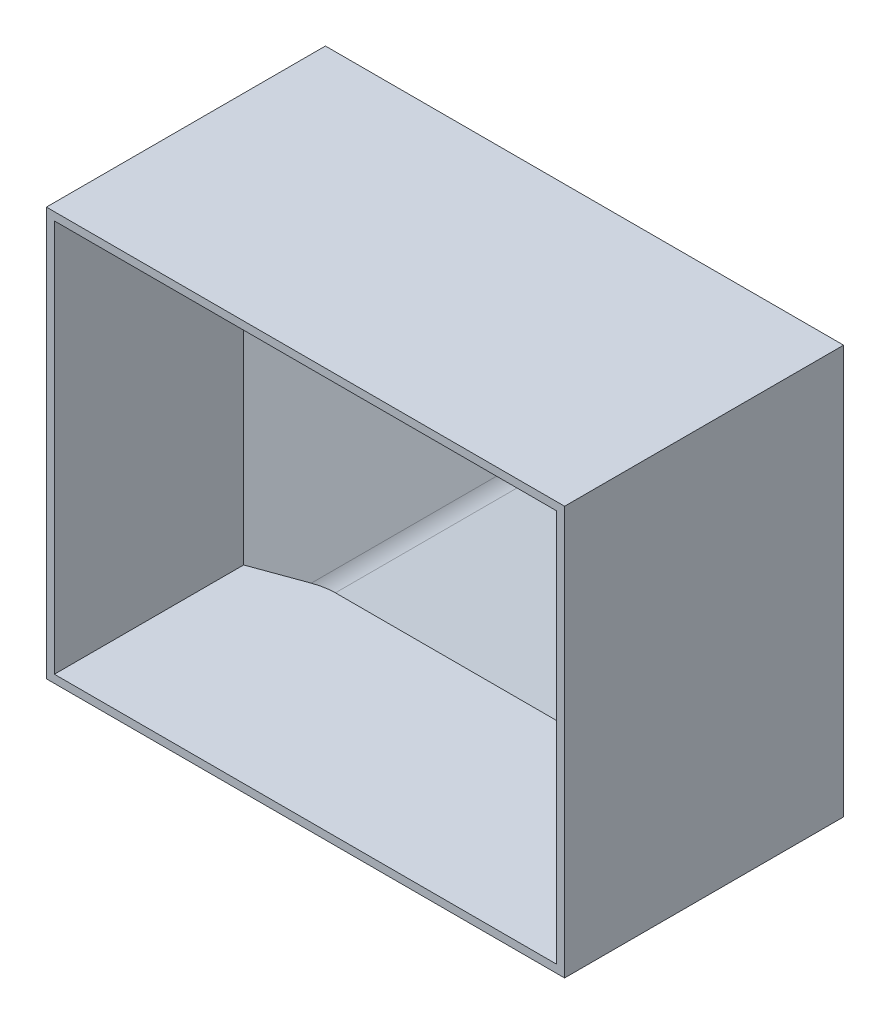
ISO-10303-21;
HEADER;
FILE_DESCRIPTION(('STEP AP214'),'2;1');
FILE_NAME('part.step','',(''),(''),'','','');
FILE_SCHEMA(('AUTOMOTIVE_DESIGN { 1 0 10303 214 1 1 1 1 }'));
ENDSEC;
DATA;
#1=APPLICATION_CONTEXT('core data for automotive mechanical design processes');
#2=APPLICATION_PROTOCOL_DEFINITION('international standard','automotive_design',2000,#1);
#3=PRODUCT_CONTEXT('',#1,'mechanical');
#4=PRODUCT('Part','Part','',(#3));
#5=PRODUCT_RELATED_PRODUCT_CATEGORY('part','',(#4));
#6=PRODUCT_DEFINITION_FORMATION('','',#4);
#7=PRODUCT_DEFINITION_CONTEXT('part definition',#1,'design');
#8=PRODUCT_DEFINITION('design','',#6,#7);
#9=PRODUCT_DEFINITION_SHAPE('','',#8);
#10=(LENGTH_UNIT() NAMED_UNIT(*) SI_UNIT(.MILLI.,.METRE.));
#11=(NAMED_UNIT(*) PLANE_ANGLE_UNIT() SI_UNIT($,.RADIAN.));
#12=(NAMED_UNIT(*) SI_UNIT($,.STERADIAN.) SOLID_ANGLE_UNIT());
#13=UNCERTAINTY_MEASURE_WITH_UNIT(LENGTH_MEASURE(1.E-05),#10,'distance_accuracy_value','');
#14=(GEOMETRIC_REPRESENTATION_CONTEXT(3) GLOBAL_UNCERTAINTY_ASSIGNED_CONTEXT((#13)) GLOBAL_UNIT_ASSIGNED_CONTEXT((#10,
#11,#12)) REPRESENTATION_CONTEXT('',''));
#15=CARTESIAN_POINT('',(0.,0.,0.));
#16=DIRECTION('',(0.,0.,1.));
#17=DIRECTION('',(1.,0.,0.));
#18=AXIS2_PLACEMENT_3D('',#15,#16,#17);
#19=CARTESIAN_POINT('',(126.,102.5,140.));
#20=DIRECTION('',(-1.,0.,0.));
#21=DIRECTION('',(0.,0.,1.));
#22=AXIS2_PLACEMENT_3D('',#19,#20,#21);
#23=PLANE('',#22);
#24=DIRECTION('',(0.,0.,-1.));
#25=VECTOR('',#24,1.);
#26=CARTESIAN_POINT('',(126.,98.5,140.));
#27=LINE('',#26,#25);
#28=CARTESIAN_POINT('',(126.,98.5,140.));
#29=VERTEX_POINT('',#28);
#30=CARTESIAN_POINT('',(126.,98.5,45.0367257692824));
#31=VERTEX_POINT('',#30);
#32=EDGE_CURVE('E182',#29,#31,#27,.T.);
#33=ORIENTED_EDGE('',*,*,#32,.T.);
#34=DIRECTION('',(0.,-1.,0.));
#35=VECTOR('',#34,1.);
#36=CARTESIAN_POINT('',(126.,102.5,45.0367257692824));
#37=LINE('',#36,#35);
#38=CARTESIAN_POINT('',(126.,-98.5,45.0367257692824));
#39=VERTEX_POINT('',#38);
#40=EDGE_CURVE('E275',#31,#39,#37,.T.);
#41=ORIENTED_EDGE('',*,*,#40,.T.);
#42=DIRECTION('',(0.,0.,-1.));
#43=VECTOR('',#42,1.);
#44=CARTESIAN_POINT('',(126.,-98.5,140.));
#45=LINE('',#44,#43);
#46=CARTESIAN_POINT('',(126.,-98.5,140.));
#47=VERTEX_POINT('',#46);
#48=EDGE_CURVE('E187',#47,#39,#45,.T.);
#49=ORIENTED_EDGE('',*,*,#48,.F.);
#50=DIRECTION('',(0.,1.,0.));
#51=VECTOR('',#50,1.);
#52=CARTESIAN_POINT('',(126.,102.5,140.));
#53=LINE('',#52,#51);
#54=EDGE_CURVE('E179',#47,#29,#53,.T.);
#55=ORIENTED_EDGE('',*,*,#54,.T.);
#56=EDGE_LOOP('',(#33,#41,#49,#55));
#57=FACE_BOUND('',#56,.T.);
#58=ADVANCED_FACE('F70',(#57),#23,.T.);
#59=CARTESIAN_POINT('',(-130.,98.5,140.));
#60=DIRECTION('',(0.,-1.,0.));
#61=DIRECTION('',(0.,0.,-1.));
#62=AXIS2_PLACEMENT_3D('',#59,#60,#61);
#63=PLANE('',#62);
#64=DIRECTION('',(0.939692620785907,0.,-0.342020143325673));
#65=VECTOR('',#64,1.);
#66=CARTESIAN_POINT('',(-160.052696911623,98.5,57.4308938416021));
#67=LINE('',#66,#65);
#68=CARTESIAN_POINT('',(-126.,98.5,45.0367257692824));
#69=VERTEX_POINT('',#68);
#70=CARTESIAN_POINT('',(-101.130302149885,98.5,35.9848960166464));
#71=VERTEX_POINT('',#70);
#72=EDGE_CURVE('E256',#69,#71,#67,.T.);
#73=ORIENTED_EDGE('',*,*,#72,.T.);
#74=CARTESIAN_POINT('',(-96.0000000000004,98.5,50.080285328435));
#75=DIRECTION('',(0.,-1.,0.));
#76=DIRECTION('',(-0.939692620785907,0.,0.342020143325673));
#77=AXIS2_PLACEMENT_3D('',#74,#75,#76);
#78=ELLIPSE('',#77,21.9044909681132,15.);
#79=CARTESIAN_POINT('',(-90.8696978501153,98.5,34.1176187412963));
#80=VERTEX_POINT('',#79);
#81=EDGE_CURVE('E305',#71,#80,#78,.T.);
#82=ORIENTED_EDGE('',*,*,#81,.T.);
#83=DIRECTION('',(1.,0.,0.));
#84=VECTOR('',#83,1.);
#85=CARTESIAN_POINT('',(-130.,98.5,34.1176187412963));
#86=LINE('',#85,#84);
#87=CARTESIAN_POINT('',(90.8696978501153,98.5,34.1176187412963));
#88=VERTEX_POINT('',#87);
#89=EDGE_CURVE('E242',#80,#88,#86,.T.);
#90=ORIENTED_EDGE('',*,*,#89,.T.);
#91=CARTESIAN_POINT('',(96.0000000000004,98.5,50.080285328435));
#92=DIRECTION('',(0.,-1.,0.));
#93=DIRECTION('',(-0.939692620785907,0.,-0.342020143325673));
#94=AXIS2_PLACEMENT_3D('',#91,#92,#93);
#95=ELLIPSE('',#94,21.9044909681132,15.);
#96=CARTESIAN_POINT('',(101.130302149886,98.5,35.9848960166464));
#97=VERTEX_POINT('',#96);
#98=EDGE_CURVE('E85',#88,#97,#95,.T.);
#99=ORIENTED_EDGE('',*,*,#98,.T.);
#100=DIRECTION('',(0.939692620785907,0.,0.342020143325673));
#101=VECTOR('',#100,1.);
#102=CARTESIAN_POINT('',(-69.533080693843,98.5,-26.1314954176489));
#103=LINE('',#102,#101);
#104=EDGE_CURVE('E200',#97,#31,#103,.T.);
#105=ORIENTED_EDGE('',*,*,#104,.T.);
#106=ORIENTED_EDGE('',*,*,#32,.F.);
#107=DIRECTION('',(-1.,0.,0.));
#108=VECTOR('',#107,1.);
#109=CARTESIAN_POINT('',(-130.,98.5,140.));
#110=LINE('',#109,#108);
#111=CARTESIAN_POINT('',(-126.,98.5,140.));
#112=VERTEX_POINT('',#111);
#113=EDGE_CURVE('E188',#29,#112,#110,.T.);
#114=ORIENTED_EDGE('',*,*,#113,.T.);
#115=DIRECTION('',(0.,0.,-1.));
#116=VECTOR('',#115,1.);
#117=CARTESIAN_POINT('',(-126.,98.5,140.));
#118=LINE('',#117,#116);
#119=EDGE_CURVE('E196',#112,#69,#118,.T.);
#120=ORIENTED_EDGE('',*,*,#119,.T.);
#121=EDGE_LOOP('',(#73,#82,#90,#99,#105,#106,#114,#120));
#122=FACE_BOUND('',#121,.T.);
#123=ADVANCED_FACE('F191',(#122),#63,.T.);
#124=CARTESIAN_POINT('',(-126.,102.5,140.));
#125=DIRECTION('',(1.,0.,0.));
#126=DIRECTION('',(0.,0.,-1.));
#127=AXIS2_PLACEMENT_3D('',#124,#125,#126);
#128=PLANE('',#127);
#129=DIRECTION('',(0.,0.,-1.));
#130=VECTOR('',#129,1.);
#131=CARTESIAN_POINT('',(-126.,-98.5,140.));
#132=LINE('',#131,#130);
#133=CARTESIAN_POINT('',(-126.,-98.5,140.));
#134=VERTEX_POINT('',#133);
#135=CARTESIAN_POINT('',(-126.,-98.5,45.0367257692824));
#136=VERTEX_POINT('',#135);
#137=EDGE_CURVE('E215',#134,#136,#132,.T.);
#138=ORIENTED_EDGE('',*,*,#137,.T.);
#139=DIRECTION('',(0.,1.,0.));
#140=VECTOR('',#139,1.);
#141=CARTESIAN_POINT('',(-126.,102.5,45.0367257692824));
#142=LINE('',#141,#140);
#143=EDGE_CURVE('E253',#136,#69,#142,.T.);
#144=ORIENTED_EDGE('',*,*,#143,.T.);
#145=ORIENTED_EDGE('',*,*,#119,.F.);
#146=DIRECTION('',(0.,-1.,0.));
#147=VECTOR('',#146,1.);
#148=CARTESIAN_POINT('',(-126.,102.5,140.));
#149=LINE('',#148,#147);
#150=EDGE_CURVE('E203',#112,#134,#149,.T.);
#151=ORIENTED_EDGE('',*,*,#150,.T.);
#152=EDGE_LOOP('',(#138,#144,#145,#151));
#153=FACE_BOUND('',#152,.T.);
#154=ADVANCED_FACE('F326',(#153),#128,.T.);
#155=CARTESIAN_POINT('',(-130.,-98.5,140.));
#156=DIRECTION('',(0.,1.,0.));
#157=DIRECTION('',(0.,0.,1.));
#158=AXIS2_PLACEMENT_3D('',#155,#156,#157);
#159=PLANE('',#158);
#160=DIRECTION('',(-1.,0.,0.));
#161=VECTOR('',#160,1.);
#162=CARTESIAN_POINT('',(-130.,-98.5,34.1176187412963));
#163=LINE('',#162,#161);
#164=CARTESIAN_POINT('',(90.8696978501153,-98.5,34.1176187412963));
#165=VERTEX_POINT('',#164);
#166=CARTESIAN_POINT('',(-90.8696978501153,-98.5,34.1176187412963));
#167=VERTEX_POINT('',#166);
#168=EDGE_CURVE('E255',#165,#167,#163,.T.);
#169=ORIENTED_EDGE('',*,*,#168,.T.);
#170=CARTESIAN_POINT('',(-96.0000000000004,-98.5,50.080285328435));
#171=DIRECTION('',(0.,1.,0.));
#172=DIRECTION('',(0.939692620785907,0.,-0.342020143325673));
#173=AXIS2_PLACEMENT_3D('',#170,#171,#172);
#174=ELLIPSE('',#173,21.9044909681132,15.);
#175=CARTESIAN_POINT('',(-101.130302149885,-98.5,35.9848960166464));
#176=VERTEX_POINT('',#175);
#177=EDGE_CURVE('E285',#167,#176,#174,.T.);
#178=ORIENTED_EDGE('',*,*,#177,.T.);
#179=DIRECTION('',(-0.939692620785907,0.,0.342020143325673));
#180=VECTOR('',#179,1.);
#181=CARTESIAN_POINT('',(-160.052696911623,-98.5,57.4308938416021));
#182=LINE('',#181,#180);
#183=EDGE_CURVE('E269',#176,#136,#182,.T.);
#184=ORIENTED_EDGE('',*,*,#183,.T.);
#185=ORIENTED_EDGE('',*,*,#137,.F.);
#186=DIRECTION('',(1.,0.,0.));
#187=VECTOR('',#186,1.);
#188=CARTESIAN_POINT('',(-130.,-98.5,140.));
#189=LINE('',#188,#187);
#190=EDGE_CURVE('E207',#134,#47,#189,.T.);
#191=ORIENTED_EDGE('',*,*,#190,.T.);
#192=ORIENTED_EDGE('',*,*,#48,.T.);
#193=DIRECTION('',(-0.939692620785907,0.,-0.342020143325673));
#194=VECTOR('',#193,1.);
#195=CARTESIAN_POINT('',(-69.533080693843,-98.5,-26.1314954176489));
#196=LINE('',#195,#194);
#197=CARTESIAN_POINT('',(101.130302149886,-98.5,35.9848960166464));
#198=VERTEX_POINT('',#197);
#199=EDGE_CURVE('E270',#39,#198,#196,.T.);
#200=ORIENTED_EDGE('',*,*,#199,.T.);
#201=CARTESIAN_POINT('',(96.0000000000004,-98.5,50.080285328435));
#202=DIRECTION('',(0.,1.,0.));
#203=DIRECTION('',(0.939692620785907,0.,0.342020143325673));
#204=AXIS2_PLACEMENT_3D('',#201,#202,#203);
#205=ELLIPSE('',#204,21.9044909681132,15.);
#206=EDGE_CURVE('E278',#198,#165,#205,.T.);
#207=ORIENTED_EDGE('',*,*,#206,.T.);
#208=EDGE_LOOP('',(#169,#178,#184,#185,#191,#192,#200,#207));
#209=FACE_BOUND('',#208,.T.);
#210=ADVANCED_FACE('F309',(#209),#159,.T.);
#211=CARTESIAN_POINT('',(0.,0.,140.));
#212=DIRECTION('',(0.,0.,1.));
#213=DIRECTION('',(1.,0.,0.));
#214=AXIS2_PLACEMENT_3D('',#211,#212,#213);
#215=PLANE('',#214);
#216=DIRECTION('',(0.,1.,0.));
#217=VECTOR('',#216,1.);
#218=CARTESIAN_POINT('',(130.,102.5,140.));
#219=LINE('',#218,#217);
#220=CARTESIAN_POINT('',(130.,-102.5,140.));
#221=VERTEX_POINT('',#220);
#222=CARTESIAN_POINT('',(130.,102.5,140.));
#223=VERTEX_POINT('',#222);
#224=EDGE_CURVE('E217',#221,#223,#219,.T.);
#225=ORIENTED_EDGE('',*,*,#224,.T.);
#226=DIRECTION('',(-1.,0.,0.));
#227=VECTOR('',#226,1.);
#228=CARTESIAN_POINT('',(-130.,102.5,140.));
#229=LINE('',#228,#227);
#230=CARTESIAN_POINT('',(-130.,102.5,140.));
#231=VERTEX_POINT('',#230);
#232=EDGE_CURVE('E216',#223,#231,#229,.T.);
#233=ORIENTED_EDGE('',*,*,#232,.T.);
#234=DIRECTION('',(0.,-1.,0.));
#235=VECTOR('',#234,1.);
#236=CARTESIAN_POINT('',(-130.,102.5,140.));
#237=LINE('',#236,#235);
#238=CARTESIAN_POINT('',(-130.,-102.5,140.));
#239=VERTEX_POINT('',#238);
#240=EDGE_CURVE('E225',#231,#239,#237,.T.);
#241=ORIENTED_EDGE('',*,*,#240,.T.);
#242=DIRECTION('',(1.,0.,0.));
#243=VECTOR('',#242,1.);
#244=CARTESIAN_POINT('',(-130.,-102.5,140.));
#245=LINE('',#244,#243);
#246=EDGE_CURVE('E223',#239,#221,#245,.T.);
#247=ORIENTED_EDGE('',*,*,#246,.T.);
#248=EDGE_LOOP('',(#225,#233,#241,#247));
#249=FACE_BOUND('',#248,.T.);
#250=ORIENTED_EDGE('',*,*,#113,.F.);
#251=ORIENTED_EDGE('',*,*,#54,.F.);
#252=ORIENTED_EDGE('',*,*,#190,.F.);
#253=ORIENTED_EDGE('',*,*,#150,.F.);
#254=EDGE_LOOP('',(#250,#251,#252,#253));
#255=FACE_BOUND('',#254,.T.);
#256=ADVANCED_FACE('F205',(#249,#255),#215,.T.);
#257=CARTESIAN_POINT('',(0.,0.,0.));
#258=DIRECTION('',(0.,0.,1.));
#259=DIRECTION('',(1.,0.,0.));
#260=AXIS2_PLACEMENT_3D('',#257,#258,#259);
#261=PLANE('',#260);
#262=CARTESIAN_POINT('',(0.,0.,0.));
#263=DIRECTION('',(0.,0.,-1.));
#264=DIRECTION('',(-1.,0.,0.));
#265=AXIS2_PLACEMENT_3D('',#262,#263,#264);
#266=CIRCLE('',#265,10.);
#267=CARTESIAN_POINT('',(-10.,0.,0.));
#268=VERTEX_POINT('',#267);
#269=EDGE_CURVE('E529',#268,#268,#266,.T.);
#270=ORIENTED_EDGE('',*,*,#269,.F.);
#271=EDGE_LOOP('',(#270));
#272=FACE_BOUND('',#271,.T.);
#273=DIRECTION('',(0.,1.,0.));
#274=VECTOR('',#273,1.);
#275=CARTESIAN_POINT('',(130.,102.5,0.));
#276=LINE('',#275,#274);
#277=CARTESIAN_POINT('',(130.,-102.5,0.));
#278=VERTEX_POINT('',#277);
#279=CARTESIAN_POINT('',(130.,102.5,0.));
#280=VERTEX_POINT('',#279);
#281=EDGE_CURVE('E199',#278,#280,#276,.T.);
#282=ORIENTED_EDGE('',*,*,#281,.F.);
#283=DIRECTION('',(1.,0.,0.));
#284=VECTOR('',#283,1.);
#285=CARTESIAN_POINT('',(-130.,-102.5,0.));
#286=LINE('',#285,#284);
#287=CARTESIAN_POINT('',(-130.,-102.5,0.));
#288=VERTEX_POINT('',#287);
#289=EDGE_CURVE('E218',#288,#278,#286,.T.);
#290=ORIENTED_EDGE('',*,*,#289,.F.);
#291=DIRECTION('',(0.,-1.,0.));
#292=VECTOR('',#291,1.);
#293=CARTESIAN_POINT('',(-130.,102.5,0.));
#294=LINE('',#293,#292);
#295=CARTESIAN_POINT('',(-130.,102.5,0.));
#296=VERTEX_POINT('',#295);
#297=EDGE_CURVE('E235',#296,#288,#294,.T.);
#298=ORIENTED_EDGE('',*,*,#297,.F.);
#299=DIRECTION('',(-1.,0.,0.));
#300=VECTOR('',#299,1.);
#301=CARTESIAN_POINT('',(-130.,102.5,0.));
#302=LINE('',#301,#300);
#303=EDGE_CURVE('E230',#280,#296,#302,.T.);
#304=ORIENTED_EDGE('',*,*,#303,.F.);
#305=EDGE_LOOP('',(#282,#290,#298,#304));
#306=FACE_BOUND('',#305,.T.);
#307=ADVANCED_FACE('F360',(#272,#306),#261,.F.);
#308=CARTESIAN_POINT('',(130.,102.5,140.));
#309=DIRECTION('',(-1.,0.,0.));
#310=DIRECTION('',(0.,0.,1.));
#311=AXIS2_PLACEMENT_3D('',#308,#309,#310);
#312=PLANE('',#311);
#313=ORIENTED_EDGE('',*,*,#281,.T.);
#314=DIRECTION('',(0.,0.,-1.));
#315=VECTOR('',#314,1.);
#316=CARTESIAN_POINT('',(130.,102.5,140.));
#317=LINE('',#316,#315);
#318=EDGE_CURVE('E245',#223,#280,#317,.T.);
#319=ORIENTED_EDGE('',*,*,#318,.F.);
#320=ORIENTED_EDGE('',*,*,#224,.F.);
#321=DIRECTION('',(0.,0.,-1.));
#322=VECTOR('',#321,1.);
#323=CARTESIAN_POINT('',(130.,-102.5,140.));
#324=LINE('',#323,#322);
#325=EDGE_CURVE('E228',#221,#278,#324,.T.);
#326=ORIENTED_EDGE('',*,*,#325,.T.);
#327=EDGE_LOOP('',(#313,#319,#320,#326));
#328=FACE_BOUND('',#327,.T.);
#329=ADVANCED_FACE('F361',(#328),#312,.F.);
#330=CARTESIAN_POINT('',(-130.,102.5,140.));
#331=DIRECTION('',(0.,-1.,0.));
#332=DIRECTION('',(0.,0.,-1.));
#333=AXIS2_PLACEMENT_3D('',#330,#331,#332);
#334=PLANE('',#333);
#335=ORIENTED_EDGE('',*,*,#303,.T.);
#336=DIRECTION('',(0.,0.,-1.));
#337=VECTOR('',#336,1.);
#338=CARTESIAN_POINT('',(-130.,102.5,140.));
#339=LINE('',#338,#337);
#340=EDGE_CURVE('E239',#231,#296,#339,.T.);
#341=ORIENTED_EDGE('',*,*,#340,.F.);
#342=ORIENTED_EDGE('',*,*,#232,.F.);
#343=ORIENTED_EDGE('',*,*,#318,.T.);
#344=EDGE_LOOP('',(#335,#341,#342,#343));
#345=FACE_BOUND('',#344,.T.);
#346=ADVANCED_FACE('F375',(#345),#334,.F.);
#347=CARTESIAN_POINT('',(-130.,102.5,140.));
#348=DIRECTION('',(1.,0.,0.));
#349=DIRECTION('',(0.,0.,-1.));
#350=AXIS2_PLACEMENT_3D('',#347,#348,#349);
#351=PLANE('',#350);
#352=ORIENTED_EDGE('',*,*,#297,.T.);
#353=DIRECTION('',(0.,0.,-1.));
#354=VECTOR('',#353,1.);
#355=CARTESIAN_POINT('',(-130.,-102.5,140.));
#356=LINE('',#355,#354);
#357=EDGE_CURVE('E238',#239,#288,#356,.T.);
#358=ORIENTED_EDGE('',*,*,#357,.F.);
#359=ORIENTED_EDGE('',*,*,#240,.F.);
#360=ORIENTED_EDGE('',*,*,#340,.T.);
#361=EDGE_LOOP('',(#352,#358,#359,#360));
#362=FACE_BOUND('',#361,.T.);
#363=ADVANCED_FACE('F368',(#362),#351,.F.);
#364=CARTESIAN_POINT('',(-130.,-102.5,140.));
#365=DIRECTION('',(0.,1.,0.));
#366=DIRECTION('',(0.,0.,1.));
#367=AXIS2_PLACEMENT_3D('',#364,#365,#366);
#368=PLANE('',#367);
#369=ORIENTED_EDGE('',*,*,#289,.T.);
#370=ORIENTED_EDGE('',*,*,#325,.F.);
#371=ORIENTED_EDGE('',*,*,#246,.F.);
#372=ORIENTED_EDGE('',*,*,#357,.T.);
#373=EDGE_LOOP('',(#369,#370,#371,#372));
#374=FACE_BOUND('',#373,.T.);
#375=ADVANCED_FACE('F362',(#374),#368,.F.);
#376=CARTESIAN_POINT('',(0.,0.,5.));
#377=DIRECTION('',(0.,0.,-1.));
#378=DIRECTION('',(-1.,0.,0.));
#379=AXIS2_PLACEMENT_3D('',#376,#377,#378);
#380=PLANE('',#379);
#381=CARTESIAN_POINT('',(0.,0.,5.));
#382=DIRECTION('',(0.,0.,-1.));
#383=DIRECTION('',(-1.,0.,0.));
#384=AXIS2_PLACEMENT_3D('',#381,#382,#383);
#385=CIRCLE('',#384,10.);
#386=CARTESIAN_POINT('',(-10.,0.,5.));
#387=VERTEX_POINT('',#386);
#388=EDGE_CURVE('E192',#387,#387,#385,.T.);
#389=ORIENTED_EDGE('',*,*,#388,.T.);
#390=EDGE_LOOP('',(#389));
#391=FACE_BOUND('',#390,.T.);
#392=DIRECTION('',(0.,-1.,0.));
#393=VECTOR('',#392,1.);
#394=CARTESIAN_POINT('',(-16.0000000000011,0.,5.));
#395=LINE('',#394,#393);
#396=CARTESIAN_POINT('',(-16.0000000000011,13.3696978501156,5.));
#397=VERTEX_POINT('',#396);
#398=CARTESIAN_POINT('',(-16.0000000000011,-13.3696978501156,5.));
#399=VERTEX_POINT('',#398);
#400=EDGE_CURVE('E261',#397,#399,#395,.T.);
#401=ORIENTED_EDGE('',*,*,#400,.T.);
#402=CARTESIAN_POINT('',(27.8570660024447,25.357066002445,5.));
#403=DIRECTION('',(0.,0.,-1.));
#404=DIRECTION('',(0.707106781186548,0.707106781186547,0.));
#405=AXIS2_PLACEMENT_3D('',#402,#403,#404);
#406=ELLIPSE('',#405,60.182094319538,15.);
#407=CARTESIAN_POINT('',(-10.8696978501161,-18.5000000000007,5.));
#408=VERTEX_POINT('',#407);
#409=EDGE_CURVE('E295',#399,#408,#406,.F.);
#410=ORIENTED_EDGE('',*,*,#409,.T.);
#411=DIRECTION('',(1.,0.,0.));
#412=VECTOR('',#411,1.);
#413=CARTESIAN_POINT('',(0.,-18.5000000000007,5.));
#414=LINE('',#413,#412);
#415=CARTESIAN_POINT('',(10.869697850116,-18.5000000000007,5.));
#416=VERTEX_POINT('',#415);
#417=EDGE_CURVE('E246',#408,#416,#414,.T.);
#418=ORIENTED_EDGE('',*,*,#417,.T.);
#419=CARTESIAN_POINT('',(-27.8570660024447,25.357066002445,5.));
#420=DIRECTION('',(0.,0.,-1.));
#421=DIRECTION('',(0.707106781186548,-0.707106781186547,0.));
#422=AXIS2_PLACEMENT_3D('',#419,#420,#421);
#423=ELLIPSE('',#422,60.182094319538,15.);
#424=CARTESIAN_POINT('',(16.0000000000011,-13.3696978501157,5.));
#425=VERTEX_POINT('',#424);
#426=EDGE_CURVE('E287',#416,#425,#423,.F.);
#427=ORIENTED_EDGE('',*,*,#426,.T.);
#428=DIRECTION('',(0.,1.,0.));
#429=VECTOR('',#428,1.);
#430=CARTESIAN_POINT('',(16.0000000000011,0.,5.));
#431=LINE('',#430,#429);
#432=CARTESIAN_POINT('',(16.0000000000011,13.3696978501157,5.));
#433=VERTEX_POINT('',#432);
#434=EDGE_CURVE('E262',#425,#433,#431,.T.);
#435=ORIENTED_EDGE('',*,*,#434,.T.);
#436=CARTESIAN_POINT('',(-27.8570660024447,-25.357066002445,5.));
#437=DIRECTION('',(0.,0.,-1.));
#438=DIRECTION('',(-0.707106781186548,-0.707106781186547,0.));
#439=AXIS2_PLACEMENT_3D('',#436,#437,#438);
#440=ELLIPSE('',#439,60.182094319538,15.);
#441=CARTESIAN_POINT('',(10.869697850116,18.5000000000008,5.));
#442=VERTEX_POINT('',#441);
#443=EDGE_CURVE('E289',#433,#442,#440,.F.);
#444=ORIENTED_EDGE('',*,*,#443,.T.);
#445=DIRECTION('',(-1.,0.,0.));
#446=VECTOR('',#445,1.);
#447=CARTESIAN_POINT('',(0.,18.5000000000008,5.));
#448=LINE('',#447,#446);
#449=CARTESIAN_POINT('',(-10.8696978501161,18.5000000000008,5.));
#450=VERTEX_POINT('',#449);
#451=EDGE_CURVE('E248',#442,#450,#448,.T.);
#452=ORIENTED_EDGE('',*,*,#451,.T.);
#453=CARTESIAN_POINT('',(27.8570660024447,-25.357066002445,5.));
#454=DIRECTION('',(0.,0.,-1.));
#455=DIRECTION('',(-0.707106781186548,0.707106781186547,0.));
#456=AXIS2_PLACEMENT_3D('',#453,#454,#455);
#457=ELLIPSE('',#456,60.182094319538,15.);
#458=EDGE_CURVE('E292',#450,#397,#457,.F.);
#459=ORIENTED_EDGE('',*,*,#458,.T.);
#460=EDGE_LOOP('',(#401,#410,#418,#427,#435,#444,#452,#459));
#461=FACE_BOUND('',#460,.T.);
#462=ADVANCED_FACE('F319',(#391,#461),#380,.F.);
#463=CARTESIAN_POINT('',(0.,0.,5.));
#464=DIRECTION('',(0.,0.,-1.));
#465=DIRECTION('',(-1.,0.,0.));
#466=AXIS2_PLACEMENT_3D('',#463,#464,#465);
#467=CYLINDRICAL_SURFACE('',#466,10.);
#468=ORIENTED_EDGE('',*,*,#388,.F.);
#469=EDGE_LOOP('',(#468));
#470=FACE_BOUND('',#469,.T.);
#471=ORIENTED_EDGE('',*,*,#269,.T.);
#472=EDGE_LOOP('',(#471));
#473=FACE_BOUND('',#472,.T.);
#474=ADVANCED_FACE('F387',(#470,#473),#467,.F.);
#475=CARTESIAN_POINT('',(-130.,98.5,34.1176187412963));
#476=DIRECTION('',(0.,0.342020143325673,-0.939692620785907));
#477=DIRECTION('',(1.,0.,0.));
#478=AXIS2_PLACEMENT_3D('',#475,#476,#477);
#479=PLANE('',#478);
#480=ORIENTED_EDGE('',*,*,#89,.F.);
#481=DIRECTION('',(0.684791078771736,-0.684791078771735,-0.249243569363957));
#482=VECTOR('',#481,1.);
#483=CARTESIAN_POINT('',(-13.2754956945574,20.9057978444421,5.87563880503845));
#484=LINE('',#483,#482);
#485=EDGE_CURVE('E296',#80,#450,#484,.T.);
#486=ORIENTED_EDGE('',*,*,#485,.T.);
#487=ORIENTED_EDGE('',*,*,#451,.F.);
#488=DIRECTION('',(0.684791078771736,0.684791078771735,0.249243569363957));
#489=VECTOR('',#488,1.);
#490=CARTESIAN_POINT('',(93.2754956945567,100.905797844441,34.9932575463348));
#491=LINE('',#490,#489);
#492=EDGE_CURVE('E298',#442,#88,#491,.T.);
#493=ORIENTED_EDGE('',*,*,#492,.T.);
#494=EDGE_LOOP('',(#480,#486,#487,#493));
#495=FACE_BOUND('',#494,.T.);
#496=ADVANCED_FACE('F336',(#495),#479,.F.);
#497=CARTESIAN_POINT('',(-130.,-98.5,34.1176187412963));
#498=DIRECTION('',(0.,-0.342020143325673,-0.939692620785907));
#499=DIRECTION('',(-1.,0.,0.));
#500=AXIS2_PLACEMENT_3D('',#497,#498,#499);
#501=PLANE('',#500);
#502=ORIENTED_EDGE('',*,*,#417,.F.);
#503=DIRECTION('',(-0.684791078771736,-0.684791078771735,0.249243569363957));
#504=VECTOR('',#503,1.);
#505=CARTESIAN_POINT('',(-93.2754956945567,-100.905797844441,34.9932575463348));
#506=LINE('',#505,#504);
#507=EDGE_CURVE('E280',#408,#167,#506,.T.);
#508=ORIENTED_EDGE('',*,*,#507,.T.);
#509=ORIENTED_EDGE('',*,*,#168,.F.);
#510=DIRECTION('',(-0.684791078771736,0.684791078771735,-0.249243569363957));
#511=VECTOR('',#510,1.);
#512=CARTESIAN_POINT('',(13.2754956945574,-20.9057978444421,5.87563880503845));
#513=LINE('',#512,#511);
#514=EDGE_CURVE('E274',#165,#416,#513,.T.);
#515=ORIENTED_EDGE('',*,*,#514,.T.);
#516=EDGE_LOOP('',(#502,#508,#509,#515));
#517=FACE_BOUND('',#516,.T.);
#518=ADVANCED_FACE('F314',(#517),#501,.F.);
#519=CARTESIAN_POINT('',(-126.,102.5,45.0367257692824));
#520=DIRECTION('',(-0.342020143325673,0.,-0.939692620785907));
#521=DIRECTION('',(0.,1.,0.));
#522=AXIS2_PLACEMENT_3D('',#519,#520,#521);
#523=PLANE('',#522);
#524=ORIENTED_EDGE('',*,*,#183,.F.);
#525=DIRECTION('',(-0.684791078771736,-0.684791078771735,0.249243569363957));
#526=VECTOR('',#525,1.);
#527=CARTESIAN_POINT('',(-18.4057978444425,-15.775495694557,5.87563880503846));
#528=LINE('',#527,#526);
#529=EDGE_CURVE('E286',#176,#399,#528,.F.);
#530=ORIENTED_EDGE('',*,*,#529,.T.);
#531=ORIENTED_EDGE('',*,*,#400,.F.);
#532=DIRECTION('',(0.684791078771736,-0.684791078771735,-0.249243569363957));
#533=VECTOR('',#532,1.);
#534=CARTESIAN_POINT('',(-98.4057978444418,95.7754956945562,34.9932575463348));
#535=LINE('',#534,#533);
#536=EDGE_CURVE('E281',#397,#71,#535,.F.);
#537=ORIENTED_EDGE('',*,*,#536,.T.);
#538=ORIENTED_EDGE('',*,*,#72,.F.);
#539=ORIENTED_EDGE('',*,*,#143,.F.);
#540=EDGE_LOOP('',(#524,#530,#531,#537,#538,#539));
#541=FACE_BOUND('',#540,.T.);
#542=ADVANCED_FACE('F330',(#541),#523,.F.);
#543=CARTESIAN_POINT('',(126.,102.5,45.0367257692824));
#544=DIRECTION('',(0.342020143325673,0.,-0.939692620785907));
#545=DIRECTION('',(0.,-1.,0.));
#546=AXIS2_PLACEMENT_3D('',#543,#544,#545);
#547=PLANE('',#546);
#548=ORIENTED_EDGE('',*,*,#104,.F.);
#549=DIRECTION('',(0.684791078771736,0.684791078771735,0.249243569363957));
#550=VECTOR('',#549,1.);
#551=CARTESIAN_POINT('',(18.4057978444425,15.775495694557,5.87563880503845));
#552=LINE('',#551,#550);
#553=EDGE_CURVE('E12',#97,#433,#552,.F.);
#554=ORIENTED_EDGE('',*,*,#553,.T.);
#555=ORIENTED_EDGE('',*,*,#434,.F.);
#556=DIRECTION('',(-0.684791078771736,0.684791078771735,-0.249243569363957));
#557=VECTOR('',#556,1.);
#558=CARTESIAN_POINT('',(98.4057978444417,-95.7754956945562,34.9932575463348));
#559=LINE('',#558,#557);
#560=EDGE_CURVE('E74',#425,#198,#559,.F.);
#561=ORIENTED_EDGE('',*,*,#560,.T.);
#562=ORIENTED_EDGE('',*,*,#199,.F.);
#563=ORIENTED_EDGE('',*,*,#40,.F.);
#564=EDGE_LOOP('',(#548,#554,#555,#561,#562,#563));
#565=FACE_BOUND('',#564,.T.);
#566=ADVANCED_FACE('F306',(#565),#547,.F.);
#567=CARTESIAN_POINT('',(-109.219415627779,-111.719415627778,54.8917591313398));
#568=DIRECTION('',(0.684791078771736,0.684791078771735,-0.249243569363957));
#569=DIRECTION('',(-0.707106781186547,0.707106781186548,0.));
#570=AXIS2_PLACEMENT_3D('',#567,#568,#569);
#571=CYLINDRICAL_SURFACE('',#570,15.);
#572=ORIENTED_EDGE('',*,*,#409,.F.);
#573=ORIENTED_EDGE('',*,*,#529,.F.);
#574=ORIENTED_EDGE('',*,*,#177,.F.);
#575=ORIENTED_EDGE('',*,*,#507,.F.);
#576=EDGE_LOOP('',(#572,#573,#574,#575));
#577=FACE_BOUND('',#576,.T.);
#578=ADVANCED_FACE('F324',(#577),#571,.F.);
#579=CARTESIAN_POINT('',(-109.219415627779,111.719415627778,54.8917591313398));
#580=DIRECTION('',(-0.684791078771736,0.684791078771735,0.249243569363957));
#581=DIRECTION('',(-0.707106781186547,-0.707106781186548,0.));
#582=AXIS2_PLACEMENT_3D('',#579,#580,#581);
#583=CYLINDRICAL_SURFACE('',#582,15.);
#584=ORIENTED_EDGE('',*,*,#81,.F.);
#585=ORIENTED_EDGE('',*,*,#536,.F.);
#586=ORIENTED_EDGE('',*,*,#458,.F.);
#587=ORIENTED_EDGE('',*,*,#485,.F.);
#588=EDGE_LOOP('',(#584,#585,#586,#587));
#589=FACE_BOUND('',#588,.T.);
#590=ADVANCED_FACE('F334',(#589),#583,.F.);
#591=CARTESIAN_POINT('',(-12.7046779792143,-10.2046779792146,10.5150182185076));
#592=DIRECTION('',(-0.684791078771736,-0.684791078771735,-0.249243569363957));
#593=DIRECTION('',(0.707106781186547,-0.707106781186548,0.));
#594=AXIS2_PLACEMENT_3D('',#591,#592,#593);
#595=CYLINDRICAL_SURFACE('',#594,15.);
#596=ORIENTED_EDGE('',*,*,#443,.F.);
#597=ORIENTED_EDGE('',*,*,#553,.F.);
#598=ORIENTED_EDGE('',*,*,#98,.F.);
#599=ORIENTED_EDGE('',*,*,#492,.F.);
#600=EDGE_LOOP('',(#596,#597,#598,#599));
#601=FACE_BOUND('',#600,.T.);
#602=ADVANCED_FACE('F338',(#601),#595,.F.);
#603=CARTESIAN_POINT('',(-12.7046779792143,10.2046779792147,10.5150182185076));
#604=DIRECTION('',(0.684791078771736,-0.684791078771735,0.249243569363957));
#605=DIRECTION('',(0.707106781186547,0.707106781186548,0.));
#606=AXIS2_PLACEMENT_3D('',#603,#604,#605);
#607=CYLINDRICAL_SURFACE('',#606,15.);
#608=ORIENTED_EDGE('',*,*,#206,.F.);
#609=ORIENTED_EDGE('',*,*,#560,.F.);
#610=ORIENTED_EDGE('',*,*,#426,.F.);
#611=ORIENTED_EDGE('',*,*,#514,.F.);
#612=EDGE_LOOP('',(#608,#609,#610,#611));
#613=FACE_BOUND('',#612,.T.);
#614=ADVANCED_FACE('F66',(#613),#607,.F.);
#615=CLOSED_SHELL('',(#58,#123,#154,#210,#256,#307,#329,#346,#363,#375,#462,#474,#496,#518,#542,
#566,#578,#590,#602,#614));
#616=MANIFOLD_SOLID_BREP('B2',#615);
#617=ADVANCED_BREP_SHAPE_REPRESENTATION('',(#18,#616),#14);
#618=SHAPE_DEFINITION_REPRESENTATION(#9,#617);
ENDSEC;
END-ISO-10303-21;
